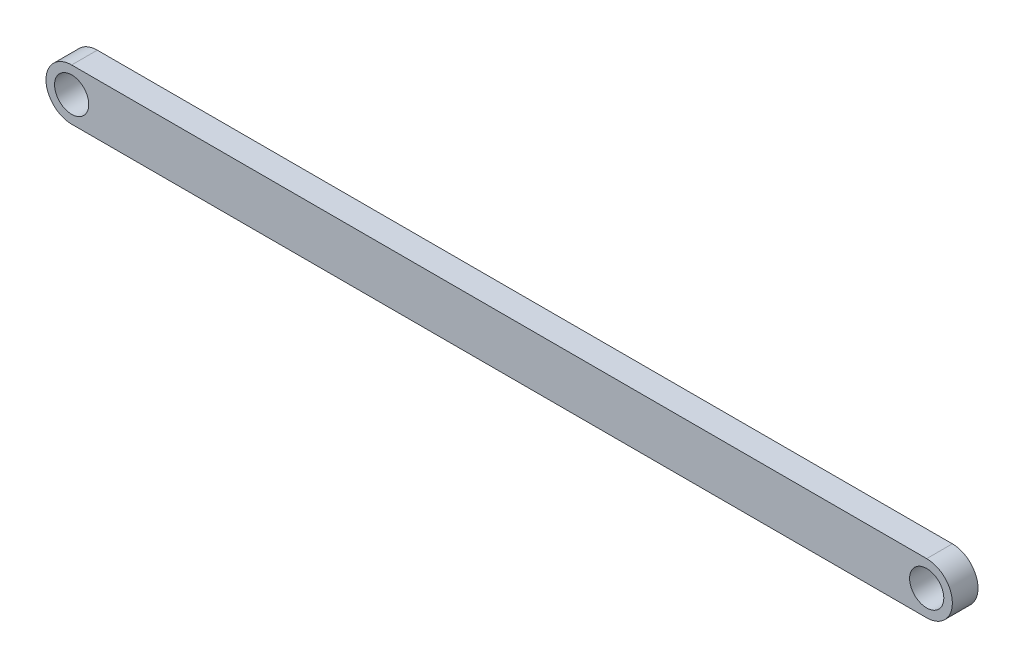
ISO-10303-21;
HEADER;
FILE_DESCRIPTION(('STEP AP214'),'2;1');
FILE_NAME('part.step','',(''),(''),'','','');
FILE_SCHEMA(('AUTOMOTIVE_DESIGN { 1 0 10303 214 1 1 1 1 }'));
ENDSEC;
DATA;
#1=APPLICATION_CONTEXT('core data for automotive mechanical design processes');
#2=APPLICATION_PROTOCOL_DEFINITION('international standard','automotive_design',2000,#1);
#3=PRODUCT_CONTEXT('',#1,'mechanical');
#4=PRODUCT('Part','Part','',(#3));
#5=PRODUCT_RELATED_PRODUCT_CATEGORY('part','',(#4));
#6=PRODUCT_DEFINITION_FORMATION('','',#4);
#7=PRODUCT_DEFINITION_CONTEXT('part definition',#1,'design');
#8=PRODUCT_DEFINITION('design','',#6,#7);
#9=PRODUCT_DEFINITION_SHAPE('','',#8);
#10=(LENGTH_UNIT() NAMED_UNIT(*) SI_UNIT(.MILLI.,.METRE.));
#11=(NAMED_UNIT(*) PLANE_ANGLE_UNIT() SI_UNIT($,.RADIAN.));
#12=(NAMED_UNIT(*) SI_UNIT($,.STERADIAN.) SOLID_ANGLE_UNIT());
#13=UNCERTAINTY_MEASURE_WITH_UNIT(LENGTH_MEASURE(1.E-05),#10,'distance_accuracy_value','');
#14=(GEOMETRIC_REPRESENTATION_CONTEXT(3) GLOBAL_UNCERTAINTY_ASSIGNED_CONTEXT((#13)) GLOBAL_UNIT_ASSIGNED_CONTEXT((#10,
#11,#12)) REPRESENTATION_CONTEXT('',''));
#15=CARTESIAN_POINT('',(0.,0.,0.));
#16=DIRECTION('',(0.,0.,1.));
#17=DIRECTION('',(1.,0.,0.));
#18=AXIS2_PLACEMENT_3D('',#15,#16,#17);
#19=CARTESIAN_POINT('',(-500.,0.,15.));
#20=DIRECTION('',(0.,0.,-1.));
#21=DIRECTION('',(-1.,0.,0.));
#22=AXIS2_PLACEMENT_3D('',#19,#20,#21);
#23=PLANE('',#22);
#24=CARTESIAN_POINT('',(-500.,0.,15.));
#25=DIRECTION('',(0.,0.,1.));
#26=DIRECTION('',(1.,0.,0.));
#27=AXIS2_PLACEMENT_3D('',#24,#25,#26);
#28=CIRCLE('',#27,9.99999999999998);
#29=CARTESIAN_POINT('',(-490.,0.,15.));
#30=VERTEX_POINT('',#29);
#31=EDGE_CURVE('E85',#30,#30,#28,.T.);
#32=ORIENTED_EDGE('',*,*,#31,.F.);
#33=EDGE_LOOP('',(#32));
#34=FACE_BOUND('',#33,.T.);
#35=CARTESIAN_POINT('',(-500.,0.,15.));
#36=DIRECTION('',(0.,0.,1.));
#37=DIRECTION('',(-1.,0.,0.));
#38=AXIS2_PLACEMENT_3D('',#35,#36,#37);
#39=CIRCLE('',#38,15.);
#40=CARTESIAN_POINT('',(-500.,15.,15.));
#41=VERTEX_POINT('',#40);
#42=CARTESIAN_POINT('',(-500.,-15.,15.));
#43=VERTEX_POINT('',#42);
#44=EDGE_CURVE('E95',#41,#43,#39,.T.);
#45=ORIENTED_EDGE('',*,*,#44,.T.);
#46=DIRECTION('',(1.,0.,0.));
#47=VECTOR('',#46,1.);
#48=CARTESIAN_POINT('',(-500.,-15.,15.));
#49=LINE('',#48,#47);
#50=CARTESIAN_POINT('',(0.,-15.,15.));
#51=VERTEX_POINT('',#50);
#52=EDGE_CURVE('E80',#43,#51,#49,.T.);
#53=ORIENTED_EDGE('',*,*,#52,.T.);
#54=CARTESIAN_POINT('',(0.,0.,15.));
#55=DIRECTION('',(0.,0.,1.));
#56=DIRECTION('',(1.,0.,0.));
#57=AXIS2_PLACEMENT_3D('',#54,#55,#56);
#58=CIRCLE('',#57,15.);
#59=CARTESIAN_POINT('',(0.,15.,15.));
#60=VERTEX_POINT('',#59);
#61=EDGE_CURVE('E46',#51,#60,#58,.T.);
#62=ORIENTED_EDGE('',*,*,#61,.T.);
#63=DIRECTION('',(-1.,0.,0.));
#64=VECTOR('',#63,1.);
#65=CARTESIAN_POINT('',(-500.,15.,15.));
#66=LINE('',#65,#64);
#67=EDGE_CURVE('E41',#60,#41,#66,.T.);
#68=ORIENTED_EDGE('',*,*,#67,.T.);
#69=EDGE_LOOP('',(#45,#53,#62,#68));
#70=FACE_BOUND('',#69,.T.);
#71=CARTESIAN_POINT('',(0.,0.,15.));
#72=DIRECTION('',(0.,0.,1.));
#73=DIRECTION('',(1.,0.,0.));
#74=AXIS2_PLACEMENT_3D('',#71,#72,#73);
#75=CIRCLE('',#74,10.);
#76=CARTESIAN_POINT('',(10.,0.,15.));
#77=VERTEX_POINT('',#76);
#78=EDGE_CURVE('E113',#77,#77,#75,.T.);
#79=ORIENTED_EDGE('',*,*,#78,.F.);
#80=EDGE_LOOP('',(#79));
#81=FACE_BOUND('',#80,.T.);
#82=ADVANCED_FACE('F26',(#34,#70,#81),#23,.F.);
#83=CARTESIAN_POINT('',(-500.,0.,0.));
#84=DIRECTION('',(0.,0.,-1.));
#85=DIRECTION('',(-1.,0.,0.));
#86=AXIS2_PLACEMENT_3D('',#83,#84,#85);
#87=PLANE('',#86);
#88=CARTESIAN_POINT('',(-500.,0.,0.));
#89=DIRECTION('',(0.,0.,1.));
#90=DIRECTION('',(1.,0.,0.));
#91=AXIS2_PLACEMENT_3D('',#88,#89,#90);
#92=CIRCLE('',#91,9.99999999999998);
#93=CARTESIAN_POINT('',(-490.,0.,0.));
#94=VERTEX_POINT('',#93);
#95=EDGE_CURVE('E88',#94,#94,#92,.T.);
#96=ORIENTED_EDGE('',*,*,#95,.T.);
#97=EDGE_LOOP('',(#96));
#98=FACE_BOUND('',#97,.T.);
#99=CARTESIAN_POINT('',(-500.,0.,0.));
#100=DIRECTION('',(0.,0.,1.));
#101=DIRECTION('',(-1.,0.,0.));
#102=AXIS2_PLACEMENT_3D('',#99,#100,#101);
#103=CIRCLE('',#102,15.);
#104=CARTESIAN_POINT('',(-500.,15.,0.));
#105=VERTEX_POINT('',#104);
#106=CARTESIAN_POINT('',(-500.,-15.,0.));
#107=VERTEX_POINT('',#106);
#108=EDGE_CURVE('E72',#105,#107,#103,.T.);
#109=ORIENTED_EDGE('',*,*,#108,.F.);
#110=DIRECTION('',(-1.,0.,0.));
#111=VECTOR('',#110,1.);
#112=CARTESIAN_POINT('',(-500.,15.,0.));
#113=LINE('',#112,#111);
#114=CARTESIAN_POINT('',(0.,15.,0.));
#115=VERTEX_POINT('',#114);
#116=EDGE_CURVE('E93',#115,#105,#113,.T.);
#117=ORIENTED_EDGE('',*,*,#116,.F.);
#118=CARTESIAN_POINT('',(0.,0.,0.));
#119=DIRECTION('',(0.,0.,1.));
#120=DIRECTION('',(1.,0.,0.));
#121=AXIS2_PLACEMENT_3D('',#118,#119,#120);
#122=CIRCLE('',#121,15.);
#123=CARTESIAN_POINT('',(0.,-15.,0.));
#124=VERTEX_POINT('',#123);
#125=EDGE_CURVE('E73',#124,#115,#122,.T.);
#126=ORIENTED_EDGE('',*,*,#125,.F.);
#127=DIRECTION('',(1.,0.,0.));
#128=VECTOR('',#127,1.);
#129=CARTESIAN_POINT('',(-500.,-15.,0.));
#130=LINE('',#129,#128);
#131=EDGE_CURVE('E67',#107,#124,#130,.T.);
#132=ORIENTED_EDGE('',*,*,#131,.F.);
#133=EDGE_LOOP('',(#109,#117,#126,#132));
#134=FACE_BOUND('',#133,.T.);
#135=CARTESIAN_POINT('',(0.,0.,0.));
#136=DIRECTION('',(0.,0.,1.));
#137=DIRECTION('',(1.,0.,0.));
#138=AXIS2_PLACEMENT_3D('',#135,#136,#137);
#139=CIRCLE('',#138,10.);
#140=CARTESIAN_POINT('',(10.,0.,0.));
#141=VERTEX_POINT('',#140);
#142=EDGE_CURVE('E115',#141,#141,#139,.T.);
#143=ORIENTED_EDGE('',*,*,#142,.T.);
#144=EDGE_LOOP('',(#143));
#145=FACE_BOUND('',#144,.T.);
#146=ADVANCED_FACE('F68',(#98,#134,#145),#87,.T.);
#147=CARTESIAN_POINT('',(-500.,0.,15.));
#148=DIRECTION('',(0.,0.,-1.));
#149=DIRECTION('',(-1.,0.,0.));
#150=AXIS2_PLACEMENT_3D('',#147,#148,#149);
#151=CYLINDRICAL_SURFACE('',#150,15.);
#152=ORIENTED_EDGE('',*,*,#108,.T.);
#153=DIRECTION('',(0.,0.,-1.));
#154=VECTOR('',#153,1.);
#155=CARTESIAN_POINT('',(-500.,-15.,15.));
#156=LINE('',#155,#154);
#157=EDGE_CURVE('E11',#43,#107,#156,.T.);
#158=ORIENTED_EDGE('',*,*,#157,.F.);
#159=ORIENTED_EDGE('',*,*,#44,.F.);
#160=DIRECTION('',(0.,0.,-1.));
#161=VECTOR('',#160,1.);
#162=CARTESIAN_POINT('',(-500.,15.,15.));
#163=LINE('',#162,#161);
#164=EDGE_CURVE('E84',#41,#105,#163,.T.);
#165=ORIENTED_EDGE('',*,*,#164,.T.);
#166=EDGE_LOOP('',(#152,#158,#159,#165));
#167=FACE_BOUND('',#166,.T.);
#168=ADVANCED_FACE('F28',(#167),#151,.T.);
#169=CARTESIAN_POINT('',(-500.,-15.,15.));
#170=DIRECTION('',(0.,1.,0.));
#171=DIRECTION('',(-1.,0.,0.));
#172=AXIS2_PLACEMENT_3D('',#169,#170,#171);
#173=PLANE('',#172);
#174=ORIENTED_EDGE('',*,*,#131,.T.);
#175=DIRECTION('',(0.,0.,-1.));
#176=VECTOR('',#175,1.);
#177=CARTESIAN_POINT('',(0.,-15.,15.));
#178=LINE('',#177,#176);
#179=EDGE_CURVE('E34',#51,#124,#178,.T.);
#180=ORIENTED_EDGE('',*,*,#179,.F.);
#181=ORIENTED_EDGE('',*,*,#52,.F.);
#182=ORIENTED_EDGE('',*,*,#157,.T.);
#183=EDGE_LOOP('',(#174,#180,#181,#182));
#184=FACE_BOUND('',#183,.T.);
#185=ADVANCED_FACE('F79',(#184),#173,.F.);
#186=CARTESIAN_POINT('',(0.,0.,15.));
#187=DIRECTION('',(0.,0.,-1.));
#188=DIRECTION('',(-1.,0.,0.));
#189=AXIS2_PLACEMENT_3D('',#186,#187,#188);
#190=CYLINDRICAL_SURFACE('',#189,15.);
#191=ORIENTED_EDGE('',*,*,#125,.T.);
#192=DIRECTION('',(0.,0.,-1.));
#193=VECTOR('',#192,1.);
#194=CARTESIAN_POINT('',(0.,15.,15.));
#195=LINE('',#194,#193);
#196=EDGE_CURVE('E101',#60,#115,#195,.T.);
#197=ORIENTED_EDGE('',*,*,#196,.F.);
#198=ORIENTED_EDGE('',*,*,#61,.F.);
#199=ORIENTED_EDGE('',*,*,#179,.T.);
#200=EDGE_LOOP('',(#191,#197,#198,#199));
#201=FACE_BOUND('',#200,.T.);
#202=ADVANCED_FACE('F104',(#201),#190,.T.);
#203=CARTESIAN_POINT('',(-500.,15.,15.));
#204=DIRECTION('',(0.,-1.,0.));
#205=DIRECTION('',(0.,0.,-1.));
#206=AXIS2_PLACEMENT_3D('',#203,#204,#205);
#207=PLANE('',#206);
#208=ORIENTED_EDGE('',*,*,#116,.T.);
#209=ORIENTED_EDGE('',*,*,#164,.F.);
#210=ORIENTED_EDGE('',*,*,#67,.F.);
#211=ORIENTED_EDGE('',*,*,#196,.T.);
#212=EDGE_LOOP('',(#208,#209,#210,#211));
#213=FACE_BOUND('',#212,.T.);
#214=ADVANCED_FACE('F106',(#213),#207,.F.);
#215=CARTESIAN_POINT('',(-500.,0.,15.));
#216=DIRECTION('',(0.,0.,-1.));
#217=DIRECTION('',(-1.,0.,0.));
#218=AXIS2_PLACEMENT_3D('',#215,#216,#217);
#219=CYLINDRICAL_SURFACE('',#218,9.99999999999998);
#220=ORIENTED_EDGE('',*,*,#31,.T.);
#221=EDGE_LOOP('',(#220));
#222=FACE_BOUND('',#221,.T.);
#223=ORIENTED_EDGE('',*,*,#95,.F.);
#224=EDGE_LOOP('',(#223));
#225=FACE_BOUND('',#224,.T.);
#226=ADVANCED_FACE('F124',(#222,#225),#219,.F.);
#227=CARTESIAN_POINT('',(0.,0.,15.));
#228=DIRECTION('',(0.,0.,-1.));
#229=DIRECTION('',(-1.,0.,0.));
#230=AXIS2_PLACEMENT_3D('',#227,#228,#229);
#231=CYLINDRICAL_SURFACE('',#230,10.);
#232=ORIENTED_EDGE('',*,*,#78,.T.);
#233=EDGE_LOOP('',(#232));
#234=FACE_BOUND('',#233,.T.);
#235=ORIENTED_EDGE('',*,*,#142,.F.);
#236=EDGE_LOOP('',(#235));
#237=FACE_BOUND('',#236,.T.);
#238=ADVANCED_FACE('F122',(#234,#237),#231,.F.);
#239=CLOSED_SHELL('',(#82,#146,#168,#185,#202,#214,#226,#238));
#240=MANIFOLD_SOLID_BREP('B2',#239);
#241=ADVANCED_BREP_SHAPE_REPRESENTATION('',(#18,#240),#14);
#242=SHAPE_DEFINITION_REPRESENTATION(#9,#241);
ENDSEC;
END-ISO-10303-21;
